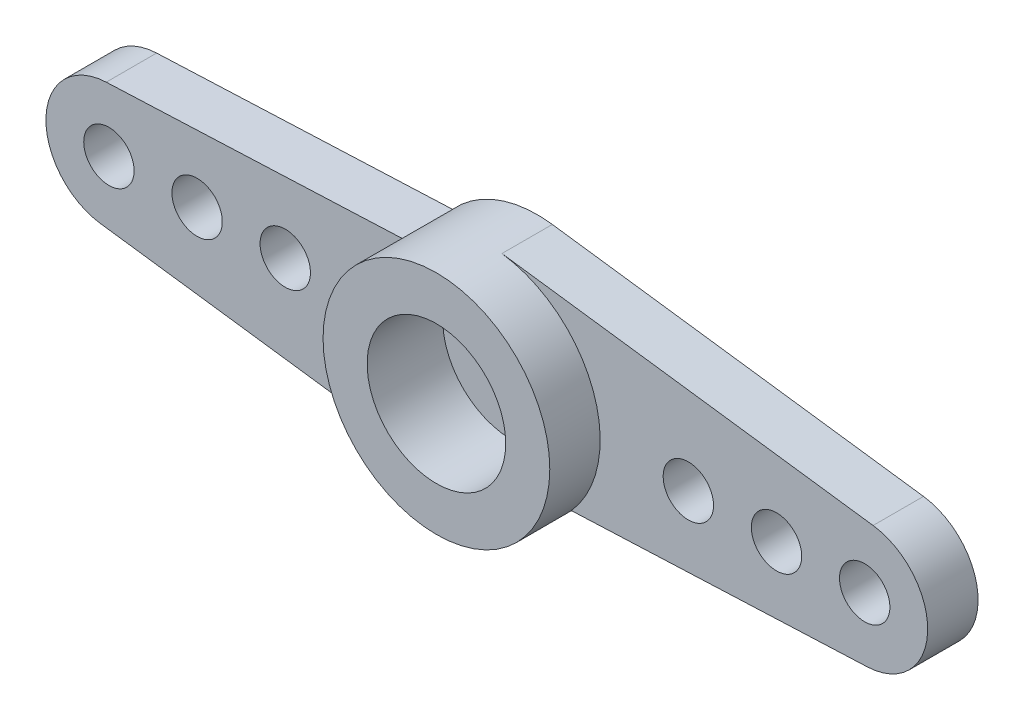
ISO-10303-21;
HEADER;
FILE_DESCRIPTION(('STEP AP214'),'2;1');
FILE_NAME('part.step','',(''),(''),'','','');
FILE_SCHEMA(('AUTOMOTIVE_DESIGN { 1 0 10303 214 1 1 1 1 }'));
ENDSEC;
DATA;
#1=APPLICATION_CONTEXT('core data for automotive mechanical design processes');
#2=APPLICATION_PROTOCOL_DEFINITION('international standard','automotive_design',2000,#1);
#3=PRODUCT_CONTEXT('',#1,'mechanical');
#4=PRODUCT('Part','Part','',(#3));
#5=PRODUCT_RELATED_PRODUCT_CATEGORY('part','',(#4));
#6=PRODUCT_DEFINITION_FORMATION('','',#4);
#7=PRODUCT_DEFINITION_CONTEXT('part definition',#1,'design');
#8=PRODUCT_DEFINITION('design','',#6,#7);
#9=PRODUCT_DEFINITION_SHAPE('','',#8);
#10=(LENGTH_UNIT() NAMED_UNIT(*) SI_UNIT(.MILLI.,.METRE.));
#11=(NAMED_UNIT(*) PLANE_ANGLE_UNIT() SI_UNIT($,.RADIAN.));
#12=(NAMED_UNIT(*) SI_UNIT($,.STERADIAN.) SOLID_ANGLE_UNIT());
#13=UNCERTAINTY_MEASURE_WITH_UNIT(LENGTH_MEASURE(1.E-05),#10,'distance_accuracy_value','');
#14=(GEOMETRIC_REPRESENTATION_CONTEXT(3) GLOBAL_UNCERTAINTY_ASSIGNED_CONTEXT((#13)) GLOBAL_UNIT_ASSIGNED_CONTEXT((#10,
#11,#12)) REPRESENTATION_CONTEXT('',''));
#15=CARTESIAN_POINT('',(0.,0.,0.));
#16=DIRECTION('',(0.,0.,1.));
#17=DIRECTION('',(1.,0.,0.));
#18=AXIS2_PLACEMENT_3D('',#15,#16,#17);
#19=CARTESIAN_POINT('',(0.,0.,0.965988641));
#20=DIRECTION('',(0.,0.,1.));
#21=DIRECTION('',(1.,0.,0.));
#22=AXIS2_PLACEMENT_3D('',#19,#20,#21);
#23=CYLINDRICAL_SURFACE('',#22,1.5);
#24=CARTESIAN_POINT('',(0.,0.,0.965988641041804));
#25=DIRECTION('',(0.,0.,-1.));
#26=DIRECTION('',(-1.,0.,0.));
#27=AXIS2_PLACEMENT_3D('',#24,#25,#26);
#28=CIRCLE('',#27,1.49999999996453);
#29=CARTESIAN_POINT('',(-1.49999999996453,0.,0.965988641041804));
#30=VERTEX_POINT('',#29);
#31=EDGE_CURVE('E132',#30,#30,#28,.T.);
#32=ORIENTED_EDGE('',*,*,#31,.T.);
#33=EDGE_LOOP('',(#32));
#34=FACE_BOUND('',#33,.T.);
#35=CARTESIAN_POINT('',(0.,0.,1.));
#36=DIRECTION('',(0.,0.,1.));
#37=DIRECTION('',(1.,0.,0.));
#38=AXIS2_PLACEMENT_3D('',#35,#36,#37);
#39=CIRCLE('',#38,1.5);
#40=CARTESIAN_POINT('',(1.5,0.,1.));
#41=VERTEX_POINT('',#40);
#42=EDGE_CURVE('E20',#41,#41,#39,.F.);
#43=ORIENTED_EDGE('',*,*,#42,.F.);
#44=EDGE_LOOP('',(#43));
#45=FACE_BOUND('',#44,.T.);
#46=ADVANCED_FACE('F17',(#34,#45),#23,.F.);
#47=CARTESIAN_POINT('',(0.,0.,0.500000000101863));
#48=DIRECTION('',(0.,0.,-1.));
#49=DIRECTION('',(-1.,0.,0.));
#50=AXIS2_PLACEMENT_3D('',#47,#48,#49);
#51=CONICAL_SURFACE('',#50,1.94999999990841,0.767944871100235);
#52=ORIENTED_EDGE('',*,*,#31,.F.);
#53=EDGE_LOOP('',(#52));
#54=FACE_BOUND('',#53,.T.);
#55=CARTESIAN_POINT('',(0.,0.,0.50000000004502));
#56=DIRECTION('',(0.,0.,-1.));
#57=DIRECTION('',(-1.,0.,0.));
#58=AXIS2_PLACEMENT_3D('',#55,#56,#57);
#59=CIRCLE('',#58,1.94999999996331);
#60=CARTESIAN_POINT('',(-1.94999999996331,0.,0.50000000004502));
#61=VERTEX_POINT('',#60);
#62=EDGE_CURVE('E226',#61,#61,#59,.T.);
#63=ORIENTED_EDGE('',*,*,#62,.T.);
#64=EDGE_LOOP('',(#63));
#65=FACE_BOUND('',#64,.T.);
#66=ADVANCED_FACE('F239',(#54,#65),#51,.F.);
#67=CARTESIAN_POINT('',(0.,0.,1.));
#68=DIRECTION('',(0.,0.,1.));
#69=DIRECTION('',(1.,0.,0.));
#70=AXIS2_PLACEMENT_3D('',#67,#68,#69);
#71=PLANE('',#70);
#72=ORIENTED_EDGE('',*,*,#42,.T.);
#73=EDGE_LOOP('',(#72));
#74=FACE_BOUND('',#73,.T.);
#75=CARTESIAN_POINT('',(0.,0.,1.));
#76=DIRECTION('',(0.,0.,1.));
#77=DIRECTION('',(1.,0.,0.));
#78=AXIS2_PLACEMENT_3D('',#75,#76,#77);
#79=CIRCLE('',#78,2.75);
#80=CARTESIAN_POINT('',(2.75,0.,1.));
#81=VERTEX_POINT('',#80);
#82=EDGE_CURVE('E223',#81,#81,#79,.T.);
#83=ORIENTED_EDGE('',*,*,#82,.T.);
#84=EDGE_LOOP('',(#83));
#85=FACE_BOUND('',#84,.T.);
#86=ADVANCED_FACE('F235',(#74,#85),#71,.T.);
#87=CARTESIAN_POINT('',(0.,0.,0.5));
#88=DIRECTION('',(0.,0.,1.));
#89=DIRECTION('',(1.,0.,0.));
#90=AXIS2_PLACEMENT_3D('',#87,#88,#89);
#91=PLANE('',#90);
#92=ORIENTED_EDGE('',*,*,#62,.F.);
#93=EDGE_LOOP('',(#92));
#94=FACE_BOUND('',#93,.T.);
#95=CARTESIAN_POINT('',(0.,0.,0.5));
#96=DIRECTION('',(0.,0.,1.));
#97=DIRECTION('',(1.,0.,0.));
#98=AXIS2_PLACEMENT_3D('',#95,#96,#97);
#99=CIRCLE('',#98,3.1);
#100=CARTESIAN_POINT('',(3.1,0.,0.5));
#101=VERTEX_POINT('',#100);
#102=EDGE_CURVE('E219',#101,#101,#99,.F.);
#103=ORIENTED_EDGE('',*,*,#102,.T.);
#104=EDGE_LOOP('',(#103));
#105=FACE_BOUND('',#104,.T.);
#106=ADVANCED_FACE('F328',(#94,#105),#91,.F.);
#107=CARTESIAN_POINT('',(0.,0.,1.));
#108=DIRECTION('',(0.,0.,1.));
#109=DIRECTION('',(1.,0.,0.));
#110=AXIS2_PLACEMENT_3D('',#107,#108,#109);
#111=CYLINDRICAL_SURFACE('',#110,2.75);
#112=ORIENTED_EDGE('',*,*,#82,.F.);
#113=EDGE_LOOP('',(#112));
#114=FACE_BOUND('',#113,.T.);
#115=CARTESIAN_POINT('',(0.,0.,4.));
#116=DIRECTION('',(0.,0.,1.));
#117=DIRECTION('',(1.,0.,0.));
#118=AXIS2_PLACEMENT_3D('',#115,#116,#117);
#119=CIRCLE('',#118,2.75);
#120=CARTESIAN_POINT('',(2.75,0.,4.));
#121=VERTEX_POINT('',#120);
#122=EDGE_CURVE('E113',#121,#121,#119,.F.);
#123=ORIENTED_EDGE('',*,*,#122,.F.);
#124=EDGE_LOOP('',(#123));
#125=FACE_BOUND('',#124,.T.);
#126=ADVANCED_FACE('F324',(#114,#125),#111,.F.);
#127=CARTESIAN_POINT('',(0.,0.,-0.5));
#128=DIRECTION('',(0.,0.,1.));
#129=DIRECTION('',(1.,0.,0.));
#130=AXIS2_PLACEMENT_3D('',#127,#128,#129);
#131=CYLINDRICAL_SURFACE('',#130,3.1);
#132=CARTESIAN_POINT('',(0.,0.,-0.5));
#133=DIRECTION('',(0.,0.,1.));
#134=DIRECTION('',(1.,0.,0.));
#135=AXIS2_PLACEMENT_3D('',#132,#133,#134);
#136=CIRCLE('',#135,3.1);
#137=CARTESIAN_POINT('',(3.1,0.,-0.5));
#138=VERTEX_POINT('',#137);
#139=EDGE_CURVE('E108',#138,#138,#136,.F.);
#140=ORIENTED_EDGE('',*,*,#139,.T.);
#141=EDGE_LOOP('',(#140));
#142=FACE_BOUND('',#141,.T.);
#143=ORIENTED_EDGE('',*,*,#102,.F.);
#144=EDGE_LOOP('',(#143));
#145=FACE_BOUND('',#144,.T.);
#146=ADVANCED_FACE('F320',(#142,#145),#131,.F.);
#147=CARTESIAN_POINT('',(0.,0.,4.));
#148=DIRECTION('',(0.,0.,1.));
#149=DIRECTION('',(1.,0.,0.));
#150=AXIS2_PLACEMENT_3D('',#147,#148,#149);
#151=PLANE('',#150);
#152=ORIENTED_EDGE('',*,*,#122,.T.);
#153=EDGE_LOOP('',(#152));
#154=FACE_BOUND('',#153,.T.);
#155=CARTESIAN_POINT('',(0.,0.,4.));
#156=DIRECTION('',(0.,0.,-1.));
#157=DIRECTION('',(-1.,0.,0.));
#158=AXIS2_PLACEMENT_3D('',#155,#156,#157);
#159=CIRCLE('',#158,4.5);
#160=CARTESIAN_POINT('',(-4.5,0.,4.));
#161=VERTEX_POINT('',#160);
#162=EDGE_CURVE('E120',#161,#161,#159,.T.);
#163=ORIENTED_EDGE('',*,*,#162,.F.);
#164=EDGE_LOOP('',(#163));
#165=FACE_BOUND('',#164,.T.);
#166=ADVANCED_FACE('F316',(#154,#165),#151,.T.);
#167=CARTESIAN_POINT('',(9.05035171900793,0.729910312,2.));
#168=DIRECTION('',(0.,0.,1.));
#169=DIRECTION('',(1.,0.,0.));
#170=AXIS2_PLACEMENT_3D('',#167,#168,#169);
#171=PLANE('',#170);
#172=CARTESIAN_POINT('',(15.,0.,2.));
#173=DIRECTION('',(0.,0.,-1.));
#174=DIRECTION('',(-1.,0.,0.));
#175=AXIS2_PLACEMENT_3D('',#172,#173,#174);
#176=CIRCLE('',#175,1.);
#177=CARTESIAN_POINT('',(14.,0.,2.));
#178=VERTEX_POINT('',#177);
#179=EDGE_CURVE('E185',#178,#178,#176,.T.);
#180=ORIENTED_EDGE('',*,*,#179,.T.);
#181=EDGE_LOOP('',(#180));
#182=FACE_BOUND('',#181,.T.);
#183=CARTESIAN_POINT('',(11.5,0.,2.));
#184=DIRECTION('',(0.,0.,-1.));
#185=DIRECTION('',(-1.,0.,0.));
#186=AXIS2_PLACEMENT_3D('',#183,#184,#185);
#187=CIRCLE('',#186,1.);
#188=CARTESIAN_POINT('',(10.5,0.,2.));
#189=VERTEX_POINT('',#188);
#190=EDGE_CURVE('E189',#189,#189,#187,.T.);
#191=ORIENTED_EDGE('',*,*,#190,.T.);
#192=EDGE_LOOP('',(#191));
#193=FACE_BOUND('',#192,.T.);
#194=CARTESIAN_POINT('',(8.,0.,2.));
#195=DIRECTION('',(0.,0.,-1.));
#196=DIRECTION('',(-1.,0.,0.));
#197=AXIS2_PLACEMENT_3D('',#194,#195,#196);
#198=CIRCLE('',#197,1.);
#199=CARTESIAN_POINT('',(7.,0.,2.));
#200=VERTEX_POINT('',#199);
#201=EDGE_CURVE('E193',#200,#200,#198,.T.);
#202=ORIENTED_EDGE('',*,*,#201,.T.);
#203=EDGE_LOOP('',(#202));
#204=FACE_BOUND('',#203,.T.);
#205=CARTESIAN_POINT('',(0.,0.,2.));
#206=DIRECTION('',(0.,0.,-1.));
#207=DIRECTION('',(-1.,0.,0.));
#208=AXIS2_PLACEMENT_3D('',#205,#206,#207);
#209=CIRCLE('',#208,4.5);
#210=CARTESIAN_POINT('',(3.3541019661298,-2.99999999999445,2.));
#211=VERTEX_POINT('',#210);
#212=CARTESIAN_POINT('',(0.599999999441466,4.45982062417292,2.));
#213=VERTEX_POINT('',#212);
#214=EDGE_CURVE('E211',#211,#213,#209,.F.);
#215=ORIENTED_EDGE('',*,*,#214,.F.);
#216=DIRECTION('',(-0.99908799725431,-0.0426986386477519,0.));
#217=VECTOR('',#216,1.);
#218=CARTESIAN_POINT('',(9.2304242815,-2.7488599965,2.));
#219=LINE('',#218,#217);
#220=CARTESIAN_POINT('',(15.1067465960855,-2.49771999309884,2.));
#221=VERTEX_POINT('',#220);
#222=EDGE_CURVE('E126',#211,#221,#219,.F.);
#223=ORIENTED_EDGE('',*,*,#222,.T.);
#224=CARTESIAN_POINT('',(15.,0.,2.));
#225=DIRECTION('',(0.,0.,-1.));
#226=DIRECTION('',(-1.,0.,0.));
#227=AXIS2_PLACEMENT_3D('',#224,#225,#226);
#228=CIRCLE('',#227,2.5);
#229=CARTESIAN_POINT('',(15.3333333331439,2.47767812498064,2.));
#230=VERTEX_POINT('',#229);
#231=EDGE_CURVE('E129',#230,#221,#228,.T.);
#232=ORIENTED_EDGE('',*,*,#231,.F.);
#233=DIRECTION('',(-0.991071249826546,0.133333333293848,0.));
#234=VECTOR('',#233,1.);
#235=CARTESIAN_POINT('',(7.9666666665,3.4687493745,2.));
#236=LINE('',#235,#234);
#237=EDGE_CURVE('E121',#213,#230,#236,.F.);
#238=ORIENTED_EDGE('',*,*,#237,.F.);
#239=EDGE_LOOP('',(#215,#223,#232,#238));
#240=FACE_BOUND('',#239,.T.);
#241=ADVANCED_FACE('F312',(#182,#193,#204,#240),#171,.T.);
#242=CARTESIAN_POINT('',(-9.05,-0.729910312,2.));
#243=DIRECTION('',(0.,0.,1.));
#244=DIRECTION('',(1.,0.,0.));
#245=AXIS2_PLACEMENT_3D('',#242,#243,#244);
#246=PLANE('',#245);
#247=CARTESIAN_POINT('',(-15.,0.,2.));
#248=DIRECTION('',(0.,0.,-1.));
#249=DIRECTION('',(-1.,0.,0.));
#250=AXIS2_PLACEMENT_3D('',#247,#248,#249);
#251=CIRCLE('',#250,1.);
#252=CARTESIAN_POINT('',(-16.,0.,2.));
#253=VERTEX_POINT('',#252);
#254=EDGE_CURVE('E181',#253,#253,#251,.T.);
#255=ORIENTED_EDGE('',*,*,#254,.T.);
#256=EDGE_LOOP('',(#255));
#257=FACE_BOUND('',#256,.T.);
#258=CARTESIAN_POINT('',(-8.,0.,2.));
#259=DIRECTION('',(0.,0.,-1.));
#260=DIRECTION('',(-1.,0.,0.));
#261=AXIS2_PLACEMENT_3D('',#258,#259,#260);
#262=CIRCLE('',#261,1.);
#263=CARTESIAN_POINT('',(-9.,0.,2.));
#264=VERTEX_POINT('',#263);
#265=EDGE_CURVE('E197',#264,#264,#262,.T.);
#266=ORIENTED_EDGE('',*,*,#265,.T.);
#267=EDGE_LOOP('',(#266));
#268=FACE_BOUND('',#267,.T.);
#269=CARTESIAN_POINT('',(-11.5,0.,2.));
#270=DIRECTION('',(0.,0.,-1.));
#271=DIRECTION('',(-1.,0.,0.));
#272=AXIS2_PLACEMENT_3D('',#269,#270,#271);
#273=CIRCLE('',#272,1.);
#274=CARTESIAN_POINT('',(-12.5,0.,2.));
#275=VERTEX_POINT('',#274);
#276=EDGE_CURVE('E201',#275,#275,#273,.T.);
#277=ORIENTED_EDGE('',*,*,#276,.T.);
#278=EDGE_LOOP('',(#277));
#279=FACE_BOUND('',#278,.T.);
#280=DIRECTION('',(-0.991071249826546,0.133333333293848,0.));
#281=VECTOR('',#280,1.);
#282=CARTESIAN_POINT('',(-7.9666666665,-3.4687493745,2.));
#283=LINE('',#282,#281);
#284=CARTESIAN_POINT('',(-15.3333333331439,-2.47767812498064,2.));
#285=VERTEX_POINT('',#284);
#286=CARTESIAN_POINT('',(-0.60000000035619,-4.45982062404986,2.));
#287=VERTEX_POINT('',#286);
#288=EDGE_CURVE('E89',#285,#287,#283,.F.);
#289=ORIENTED_EDGE('',*,*,#288,.T.);
#290=CARTESIAN_POINT('',(0.,0.,2.));
#291=DIRECTION('',(0.,0.,-1.));
#292=DIRECTION('',(-1.,0.,0.));
#293=AXIS2_PLACEMENT_3D('',#290,#291,#292);
#294=CIRCLE('',#293,4.5);
#295=CARTESIAN_POINT('',(-3.3541019661298,2.99999999999445,2.));
#296=VERTEX_POINT('',#295);
#297=EDGE_CURVE('E81',#296,#287,#294,.F.);
#298=ORIENTED_EDGE('',*,*,#297,.F.);
#299=DIRECTION('',(-0.99908799725431,-0.0426986386477519,0.));
#300=VECTOR('',#299,1.);
#301=CARTESIAN_POINT('',(-9.2304242815,2.7488599965,2.));
#302=LINE('',#301,#300);
#303=CARTESIAN_POINT('',(-15.1067465965978,2.49771999307694,2.));
#304=VERTEX_POINT('',#303);
#305=EDGE_CURVE('E91',#304,#296,#302,.F.);
#306=ORIENTED_EDGE('',*,*,#305,.F.);
#307=CARTESIAN_POINT('',(-15.,0.,2.));
#308=DIRECTION('',(0.,0.,-1.));
#309=DIRECTION('',(-1.,0.,0.));
#310=AXIS2_PLACEMENT_3D('',#307,#308,#309);
#311=CIRCLE('',#310,2.5);
#312=EDGE_CURVE('E86',#285,#304,#311,.T.);
#313=ORIENTED_EDGE('',*,*,#312,.F.);
#314=EDGE_LOOP('',(#289,#298,#306,#313));
#315=FACE_BOUND('',#314,.T.);
#316=ADVANCED_FACE('F88',(#257,#268,#279,#315),#246,.T.);
#317=CARTESIAN_POINT('',(0.,0.,-0.5));
#318=DIRECTION('',(0.,0.,1.));
#319=DIRECTION('',(1.,0.,0.));
#320=AXIS2_PLACEMENT_3D('',#317,#318,#319);
#321=PLANE('',#320);
#322=ORIENTED_EDGE('',*,*,#139,.F.);
#323=EDGE_LOOP('',(#322));
#324=FACE_BOUND('',#323,.T.);
#325=CARTESIAN_POINT('',(0.,0.,-0.5));
#326=DIRECTION('',(0.,0.,1.));
#327=DIRECTION('',(1.,0.,0.));
#328=AXIS2_PLACEMENT_3D('',#325,#326,#327);
#329=CIRCLE('',#328,3.5);
#330=CARTESIAN_POINT('',(3.5,0.,-0.5));
#331=VERTEX_POINT('',#330);
#332=EDGE_CURVE('E177',#331,#331,#329,.T.);
#333=ORIENTED_EDGE('',*,*,#332,.F.);
#334=EDGE_LOOP('',(#333));
#335=FACE_BOUND('',#334,.T.);
#336=ADVANCED_FACE('F306',(#324,#335),#321,.F.);
#337=CARTESIAN_POINT('',(-7.9666666665,-3.4687493745,1.));
#338=DIRECTION('',(0.133333333293848,0.991071249826546,0.));
#339=DIRECTION('',(-0.991071249826546,0.133333333293848,0.));
#340=AXIS2_PLACEMENT_3D('',#337,#338,#339);
#341=PLANE('',#340);
#342=DIRECTION('',(0.,0.,-1.));
#343=VECTOR('',#342,1.);
#344=CARTESIAN_POINT('',(-0.600000000915907,-4.45982062407233,4.));
#345=LINE('',#344,#343);
#346=CARTESIAN_POINT('',(-0.599999999884145,-4.45982062197136,0.));
#347=VERTEX_POINT('',#346);
#348=EDGE_CURVE('E103',#287,#347,#345,.T.);
#349=ORIENTED_EDGE('',*,*,#348,.F.);
#350=ORIENTED_EDGE('',*,*,#288,.F.);
#351=DIRECTION('',(0.,0.,1.));
#352=VECTOR('',#351,1.);
#353=CARTESIAN_POINT('',(-15.333333333,-2.477678125,1.));
#354=LINE('',#353,#352);
#355=CARTESIAN_POINT('',(-15.3333333328398,-2.4776781235152,0.));
#356=VERTEX_POINT('',#355);
#357=EDGE_CURVE('E102',#356,#285,#354,.T.);
#358=ORIENTED_EDGE('',*,*,#357,.F.);
#359=DIRECTION('',(0.991071249837847,-0.13333333320985,0.));
#360=VECTOR('',#359,1.);
#361=CARTESIAN_POINT('',(-15.33333333686,-2.477678121468,0.));
#362=LINE('',#361,#360);
#363=EDGE_CURVE('E174',#356,#347,#362,.T.);
#364=ORIENTED_EDGE('',*,*,#363,.T.);
#365=EDGE_LOOP('',(#349,#350,#358,#364));
#366=FACE_BOUND('',#365,.T.);
#367=ADVANCED_FACE('F100',(#366),#341,.F.);
#368=CARTESIAN_POINT('',(9.2304242815,-2.7488599965,1.));
#369=DIRECTION('',(-0.0426986386477519,0.99908799725431,0.));
#370=DIRECTION('',(-0.99908799725431,-0.0426986386477519,0.));
#371=AXIS2_PLACEMENT_3D('',#368,#369,#370);
#372=PLANE('',#371);
#373=DIRECTION('',(0.,0.,-1.));
#374=VECTOR('',#373,1.);
#375=CARTESIAN_POINT('',(15.1067465955568,-2.49771999318119,2.));
#376=LINE('',#375,#374);
#377=CARTESIAN_POINT('',(15.1067465958929,-2.49771999328759,0.));
#378=VERTEX_POINT('',#377);
#379=EDGE_CURVE('E125',#221,#378,#376,.T.);
#380=ORIENTED_EDGE('',*,*,#379,.F.);
#381=ORIENTED_EDGE('',*,*,#222,.F.);
#382=DIRECTION('',(0.,0.,1.));
#383=VECTOR('',#382,1.);
#384=CARTESIAN_POINT('',(3.354101966,-3.,1.));
#385=LINE('',#384,#383);
#386=CARTESIAN_POINT('',(3.35410196684039,-2.9999999992,0.));
#387=VERTEX_POINT('',#386);
#388=EDGE_CURVE('E130',#387,#211,#385,.T.);
#389=ORIENTED_EDGE('',*,*,#388,.F.);
#390=DIRECTION('',(0.999087997261162,0.0426986384874433,0.));
#391=VECTOR('',#390,1.);
#392=CARTESIAN_POINT('',(3.35410196506,-2.999999998512,0.));
#393=LINE('',#392,#391);
#394=EDGE_CURVE('E169',#387,#378,#393,.T.);
#395=ORIENTED_EDGE('',*,*,#394,.T.);
#396=EDGE_LOOP('',(#380,#381,#389,#395));
#397=FACE_BOUND('',#396,.T.);
#398=ADVANCED_FACE('F299',(#397),#372,.F.);
#399=CARTESIAN_POINT('',(15.,0.,2.));
#400=DIRECTION('',(0.,0.,-1.));
#401=DIRECTION('',(-1.,0.,0.));
#402=AXIS2_PLACEMENT_3D('',#399,#400,#401);
#403=CYLINDRICAL_SURFACE('',#402,2.5);
#404=ORIENTED_EDGE('',*,*,#379,.T.);
#405=CARTESIAN_POINT('',(15.,0.,0.));
#406=DIRECTION('',(0.,0.,-1.));
#407=DIRECTION('',(-1.,0.,0.));
#408=AXIS2_PLACEMENT_3D('',#405,#406,#407);
#409=CIRCLE('',#408,2.5);
#410=CARTESIAN_POINT('',(15.3333333328398,2.4776781235152,0.));
#411=VERTEX_POINT('',#410);
#412=EDGE_CURVE('E165',#378,#411,#409,.F.);
#413=ORIENTED_EDGE('',*,*,#412,.T.);
#414=DIRECTION('',(0.,0.,1.));
#415=VECTOR('',#414,1.);
#416=CARTESIAN_POINT('',(15.333333333,2.477678125,1.));
#417=LINE('',#416,#415);
#418=EDGE_CURVE('E124',#230,#411,#417,.F.);
#419=ORIENTED_EDGE('',*,*,#418,.F.);
#420=ORIENTED_EDGE('',*,*,#231,.T.);
#421=EDGE_LOOP('',(#404,#413,#419,#420));
#422=FACE_BOUND('',#421,.T.);
#423=ADVANCED_FACE('F295',(#422),#403,.T.);
#424=CARTESIAN_POINT('',(7.9666666665,3.4687493745,1.));
#425=DIRECTION('',(0.133333333293848,0.991071249826546,0.));
#426=DIRECTION('',(-0.991071249826546,0.133333333293848,0.));
#427=AXIS2_PLACEMENT_3D('',#424,#425,#426);
#428=PLANE('',#427);
#429=ORIENTED_EDGE('',*,*,#237,.T.);
#430=ORIENTED_EDGE('',*,*,#418,.T.);
#431=DIRECTION('',(-0.991071249837847,0.13333333320985,0.));
#432=VECTOR('',#431,1.);
#433=CARTESIAN_POINT('',(15.33333333686,2.477678121468,0.));
#434=LINE('',#433,#432);
#435=CARTESIAN_POINT('',(0.599999998969421,4.45982062209442,0.));
#436=VERTEX_POINT('',#435);
#437=EDGE_CURVE('E164',#411,#436,#434,.T.);
#438=ORIENTED_EDGE('',*,*,#437,.T.);
#439=DIRECTION('',(0.,0.,-1.));
#440=VECTOR('',#439,1.);
#441=CARTESIAN_POINT('',(0.599999999086459,4.45982062431845,4.));
#442=LINE('',#441,#440);
#443=EDGE_CURVE('E210',#213,#436,#442,.T.);
#444=ORIENTED_EDGE('',*,*,#443,.F.);
#445=EDGE_LOOP('',(#429,#430,#438,#444));
#446=FACE_BOUND('',#445,.T.);
#447=ADVANCED_FACE('F292',(#446),#428,.T.);
#448=CARTESIAN_POINT('',(0.,0.,4.));
#449=DIRECTION('',(0.,0.,-1.));
#450=DIRECTION('',(-1.,0.,0.));
#451=AXIS2_PLACEMENT_3D('',#448,#449,#450);
#452=CYLINDRICAL_SURFACE('',#451,4.5);
#453=ORIENTED_EDGE('',*,*,#388,.T.);
#454=ORIENTED_EDGE('',*,*,#214,.T.);
#455=ORIENTED_EDGE('',*,*,#443,.T.);
#456=CARTESIAN_POINT('',(0.,0.,0.));
#457=DIRECTION('',(0.,0.,-1.));
#458=DIRECTION('',(-1.,0.,0.));
#459=AXIS2_PLACEMENT_3D('',#456,#457,#458);
#460=CIRCLE('',#459,4.5);
#461=CARTESIAN_POINT('',(-3.35410196684039,2.9999999992,0.));
#462=VERTEX_POINT('',#461);
#463=EDGE_CURVE('E160',#436,#462,#460,.F.);
#464=ORIENTED_EDGE('',*,*,#463,.T.);
#465=DIRECTION('',(0.,0.,1.));
#466=VECTOR('',#465,1.);
#467=CARTESIAN_POINT('',(-3.354101966,3.,1.));
#468=LINE('',#467,#466);
#469=EDGE_CURVE('E97',#296,#462,#468,.F.);
#470=ORIENTED_EDGE('',*,*,#469,.F.);
#471=ORIENTED_EDGE('',*,*,#297,.T.);
#472=ORIENTED_EDGE('',*,*,#348,.T.);
#473=CARTESIAN_POINT('',(0.,0.,0.));
#474=DIRECTION('',(0.,0.,-1.));
#475=DIRECTION('',(-1.,0.,0.));
#476=AXIS2_PLACEMENT_3D('',#473,#474,#475);
#477=CIRCLE('',#476,4.5);
#478=EDGE_CURVE('E170',#347,#387,#477,.F.);
#479=ORIENTED_EDGE('',*,*,#478,.T.);
#480=EDGE_LOOP('',(#453,#454,#455,#464,#470,#471,#472,#479));
#481=FACE_BOUND('',#480,.T.);
#482=ORIENTED_EDGE('',*,*,#162,.T.);
#483=EDGE_LOOP('',(#482));
#484=FACE_BOUND('',#483,.T.);
#485=ADVANCED_FACE('F288',(#481,#484),#452,.T.);
#486=CARTESIAN_POINT('',(-9.2304242815,2.7488599965,1.));
#487=DIRECTION('',(-0.0426986386477519,0.99908799725431,0.));
#488=DIRECTION('',(-0.99908799725431,-0.0426986386477519,0.));
#489=AXIS2_PLACEMENT_3D('',#486,#487,#488);
#490=PLANE('',#489);
#491=ORIENTED_EDGE('',*,*,#305,.T.);
#492=ORIENTED_EDGE('',*,*,#469,.T.);
#493=DIRECTION('',(-0.999087997261161,-0.0426986384874435,0.));
#494=VECTOR('',#493,1.);
#495=CARTESIAN_POINT('',(-3.35410196506,2.999999998512,0.));
#496=LINE('',#495,#494);
#497=CARTESIAN_POINT('',(-15.1067465964052,2.4977199932657,0.));
#498=VERTEX_POINT('',#497);
#499=EDGE_CURVE('E159',#462,#498,#496,.T.);
#500=ORIENTED_EDGE('',*,*,#499,.T.);
#501=DIRECTION('',(0.,0.,-1.));
#502=VECTOR('',#501,1.);
#503=CARTESIAN_POINT('',(-15.1067465965814,2.4977199931374,2.));
#504=LINE('',#503,#502);
#505=EDGE_CURVE('E96',#304,#498,#504,.T.);
#506=ORIENTED_EDGE('',*,*,#505,.F.);
#507=EDGE_LOOP('',(#491,#492,#500,#506));
#508=FACE_BOUND('',#507,.T.);
#509=ADVANCED_FACE('F285',(#508),#490,.T.);
#510=CARTESIAN_POINT('',(-15.,0.,2.));
#511=DIRECTION('',(0.,0.,-1.));
#512=DIRECTION('',(-1.,0.,0.));
#513=AXIS2_PLACEMENT_3D('',#510,#511,#512);
#514=CYLINDRICAL_SURFACE('',#513,2.5);
#515=ORIENTED_EDGE('',*,*,#505,.T.);
#516=CARTESIAN_POINT('',(-15.,0.,0.));
#517=DIRECTION('',(0.,0.,-1.));
#518=DIRECTION('',(-1.,0.,0.));
#519=AXIS2_PLACEMENT_3D('',#516,#517,#518);
#520=CIRCLE('',#519,2.5);
#521=EDGE_CURVE('E36',#498,#356,#520,.F.);
#522=ORIENTED_EDGE('',*,*,#521,.T.);
#523=ORIENTED_EDGE('',*,*,#357,.T.);
#524=ORIENTED_EDGE('',*,*,#312,.T.);
#525=EDGE_LOOP('',(#515,#522,#523,#524));
#526=FACE_BOUND('',#525,.T.);
#527=ADVANCED_FACE('F106',(#526),#514,.T.);
#528=CARTESIAN_POINT('',(-11.5,0.,2.));
#529=DIRECTION('',(0.,0.,-1.));
#530=DIRECTION('',(-1.,0.,0.));
#531=AXIS2_PLACEMENT_3D('',#528,#529,#530);
#532=CYLINDRICAL_SURFACE('',#531,1.);
#533=ORIENTED_EDGE('',*,*,#276,.F.);
#534=EDGE_LOOP('',(#533));
#535=FACE_BOUND('',#534,.T.);
#536=CARTESIAN_POINT('',(-11.5,0.,0.));
#537=DIRECTION('',(0.,0.,-1.));
#538=DIRECTION('',(-1.,0.,0.));
#539=AXIS2_PLACEMENT_3D('',#536,#537,#538);
#540=CIRCLE('',#539,1.);
#541=CARTESIAN_POINT('',(-12.5,0.,0.));
#542=VERTEX_POINT('',#541);
#543=EDGE_CURVE('E155',#542,#542,#540,.T.);
#544=ORIENTED_EDGE('',*,*,#543,.T.);
#545=EDGE_LOOP('',(#544));
#546=FACE_BOUND('',#545,.T.);
#547=ADVANCED_FACE('F278',(#535,#546),#532,.F.);
#548=CARTESIAN_POINT('',(-8.,0.,2.));
#549=DIRECTION('',(0.,0.,-1.));
#550=DIRECTION('',(-1.,0.,0.));
#551=AXIS2_PLACEMENT_3D('',#548,#549,#550);
#552=CYLINDRICAL_SURFACE('',#551,1.);
#553=ORIENTED_EDGE('',*,*,#265,.F.);
#554=EDGE_LOOP('',(#553));
#555=FACE_BOUND('',#554,.T.);
#556=CARTESIAN_POINT('',(-8.,0.,0.));
#557=DIRECTION('',(0.,0.,-1.));
#558=DIRECTION('',(-1.,0.,0.));
#559=AXIS2_PLACEMENT_3D('',#556,#557,#558);
#560=CIRCLE('',#559,1.);
#561=CARTESIAN_POINT('',(-9.,0.,0.));
#562=VERTEX_POINT('',#561);
#563=EDGE_CURVE('E151',#562,#562,#560,.T.);
#564=ORIENTED_EDGE('',*,*,#563,.T.);
#565=EDGE_LOOP('',(#564));
#566=FACE_BOUND('',#565,.T.);
#567=ADVANCED_FACE('F274',(#555,#566),#552,.F.);
#568=CARTESIAN_POINT('',(8.,0.,2.));
#569=DIRECTION('',(0.,0.,-1.));
#570=DIRECTION('',(-1.,0.,0.));
#571=AXIS2_PLACEMENT_3D('',#568,#569,#570);
#572=CYLINDRICAL_SURFACE('',#571,1.);
#573=ORIENTED_EDGE('',*,*,#201,.F.);
#574=EDGE_LOOP('',(#573));
#575=FACE_BOUND('',#574,.T.);
#576=CARTESIAN_POINT('',(8.,0.,0.));
#577=DIRECTION('',(0.,0.,-1.));
#578=DIRECTION('',(-1.,0.,0.));
#579=AXIS2_PLACEMENT_3D('',#576,#577,#578);
#580=CIRCLE('',#579,1.);
#581=CARTESIAN_POINT('',(7.,0.,0.));
#582=VERTEX_POINT('',#581);
#583=EDGE_CURVE('E147',#582,#582,#580,.T.);
#584=ORIENTED_EDGE('',*,*,#583,.T.);
#585=EDGE_LOOP('',(#584));
#586=FACE_BOUND('',#585,.T.);
#587=ADVANCED_FACE('F270',(#575,#586),#572,.F.);
#588=CARTESIAN_POINT('',(11.5,0.,2.));
#589=DIRECTION('',(0.,0.,-1.));
#590=DIRECTION('',(-1.,0.,0.));
#591=AXIS2_PLACEMENT_3D('',#588,#589,#590);
#592=CYLINDRICAL_SURFACE('',#591,1.);
#593=ORIENTED_EDGE('',*,*,#190,.F.);
#594=EDGE_LOOP('',(#593));
#595=FACE_BOUND('',#594,.T.);
#596=CARTESIAN_POINT('',(11.5,0.,0.));
#597=DIRECTION('',(0.,0.,-1.));
#598=DIRECTION('',(-1.,0.,0.));
#599=AXIS2_PLACEMENT_3D('',#596,#597,#598);
#600=CIRCLE('',#599,1.);
#601=CARTESIAN_POINT('',(10.5,0.,0.));
#602=VERTEX_POINT('',#601);
#603=EDGE_CURVE('E143',#602,#602,#600,.T.);
#604=ORIENTED_EDGE('',*,*,#603,.T.);
#605=EDGE_LOOP('',(#604));
#606=FACE_BOUND('',#605,.T.);
#607=ADVANCED_FACE('F266',(#595,#606),#592,.F.);
#608=CARTESIAN_POINT('',(15.,0.,2.));
#609=DIRECTION('',(0.,0.,-1.));
#610=DIRECTION('',(-1.,0.,0.));
#611=AXIS2_PLACEMENT_3D('',#608,#609,#610);
#612=CYLINDRICAL_SURFACE('',#611,1.);
#613=ORIENTED_EDGE('',*,*,#179,.F.);
#614=EDGE_LOOP('',(#613));
#615=FACE_BOUND('',#614,.T.);
#616=CARTESIAN_POINT('',(15.,0.,0.));
#617=DIRECTION('',(0.,0.,-1.));
#618=DIRECTION('',(-1.,0.,0.));
#619=AXIS2_PLACEMENT_3D('',#616,#617,#618);
#620=CIRCLE('',#619,1.);
#621=CARTESIAN_POINT('',(14.,0.,0.));
#622=VERTEX_POINT('',#621);
#623=EDGE_CURVE('E139',#622,#622,#620,.T.);
#624=ORIENTED_EDGE('',*,*,#623,.T.);
#625=EDGE_LOOP('',(#624));
#626=FACE_BOUND('',#625,.T.);
#627=ADVANCED_FACE('F262',(#615,#626),#612,.F.);
#628=CARTESIAN_POINT('',(-15.,0.,2.));
#629=DIRECTION('',(0.,0.,-1.));
#630=DIRECTION('',(-1.,0.,0.));
#631=AXIS2_PLACEMENT_3D('',#628,#629,#630);
#632=CYLINDRICAL_SURFACE('',#631,1.);
#633=ORIENTED_EDGE('',*,*,#254,.F.);
#634=EDGE_LOOP('',(#633));
#635=FACE_BOUND('',#634,.T.);
#636=CARTESIAN_POINT('',(-15.,0.,0.));
#637=DIRECTION('',(0.,0.,-1.));
#638=DIRECTION('',(-1.,0.,0.));
#639=AXIS2_PLACEMENT_3D('',#636,#637,#638);
#640=CIRCLE('',#639,1.);
#641=CARTESIAN_POINT('',(-16.,0.,0.));
#642=VERTEX_POINT('',#641);
#643=EDGE_CURVE('E27',#642,#642,#640,.T.);
#644=ORIENTED_EDGE('',*,*,#643,.T.);
#645=EDGE_LOOP('',(#644));
#646=FACE_BOUND('',#645,.T.);
#647=ADVANCED_FACE('F254',(#635,#646),#632,.F.);
#648=CARTESIAN_POINT('',(0.,0.,-0.5));
#649=DIRECTION('',(0.,0.,1.));
#650=DIRECTION('',(1.,0.,0.));
#651=AXIS2_PLACEMENT_3D('',#648,#649,#650);
#652=CYLINDRICAL_SURFACE('',#651,3.5);
#653=CARTESIAN_POINT('',(0.,0.,0.));
#654=DIRECTION('',(0.,0.,1.));
#655=DIRECTION('',(1.,0.,0.));
#656=AXIS2_PLACEMENT_3D('',#653,#654,#655);
#657=CIRCLE('',#656,3.5);
#658=CARTESIAN_POINT('',(3.5,0.,0.));
#659=VERTEX_POINT('',#658);
#660=EDGE_CURVE('E11',#659,#659,#657,.F.);
#661=ORIENTED_EDGE('',*,*,#660,.T.);
#662=EDGE_LOOP('',(#661));
#663=FACE_BOUND('',#662,.T.);
#664=ORIENTED_EDGE('',*,*,#332,.T.);
#665=EDGE_LOOP('',(#664));
#666=FACE_BOUND('',#665,.T.);
#667=ADVANCED_FACE('F248',(#663,#666),#652,.T.);
#668=CARTESIAN_POINT('',(0.000351714080818688,0.,0.));
#669=DIRECTION('',(0.,0.,1.));
#670=DIRECTION('',(1.,0.,0.));
#671=AXIS2_PLACEMENT_3D('',#668,#669,#670);
#672=PLANE('',#671);
#673=ORIENTED_EDGE('',*,*,#660,.F.);
#674=EDGE_LOOP('',(#673));
#675=FACE_BOUND('',#674,.T.);
#676=ORIENTED_EDGE('',*,*,#643,.F.);
#677=EDGE_LOOP('',(#676));
#678=FACE_BOUND('',#677,.T.);
#679=ORIENTED_EDGE('',*,*,#623,.F.);
#680=EDGE_LOOP('',(#679));
#681=FACE_BOUND('',#680,.T.);
#682=ORIENTED_EDGE('',*,*,#603,.F.);
#683=EDGE_LOOP('',(#682));
#684=FACE_BOUND('',#683,.T.);
#685=ORIENTED_EDGE('',*,*,#583,.F.);
#686=EDGE_LOOP('',(#685));
#687=FACE_BOUND('',#686,.T.);
#688=ORIENTED_EDGE('',*,*,#563,.F.);
#689=EDGE_LOOP('',(#688));
#690=FACE_BOUND('',#689,.T.);
#691=ORIENTED_EDGE('',*,*,#543,.F.);
#692=EDGE_LOOP('',(#691));
#693=FACE_BOUND('',#692,.T.);
#694=ORIENTED_EDGE('',*,*,#499,.F.);
#695=ORIENTED_EDGE('',*,*,#463,.F.);
#696=ORIENTED_EDGE('',*,*,#437,.F.);
#697=ORIENTED_EDGE('',*,*,#412,.F.);
#698=ORIENTED_EDGE('',*,*,#394,.F.);
#699=ORIENTED_EDGE('',*,*,#478,.F.);
#700=ORIENTED_EDGE('',*,*,#363,.F.);
#701=ORIENTED_EDGE('',*,*,#521,.F.);
#702=EDGE_LOOP('',(#694,#695,#696,#697,#698,#699,#700,#701));
#703=FACE_BOUND('',#702,.T.);
#704=ADVANCED_FACE('F246',(#675,#678,#681,#684,#687,#690,#693,#703),#672,.F.);
#705=CLOSED_SHELL('',(#46,#66,#86,#106,#126,#146,#166,#241,#316,#336,#367,#398,#423,#447,#485,
#509,#527,#547,#567,#587,#607,#627,#647,#667,#704));
#706=MANIFOLD_SOLID_BREP('B1',#705);
#707=ADVANCED_BREP_SHAPE_REPRESENTATION('',(#18,#706),#14);
#708=SHAPE_DEFINITION_REPRESENTATION(#9,#707);
ENDSEC;
END-ISO-10303-21;
